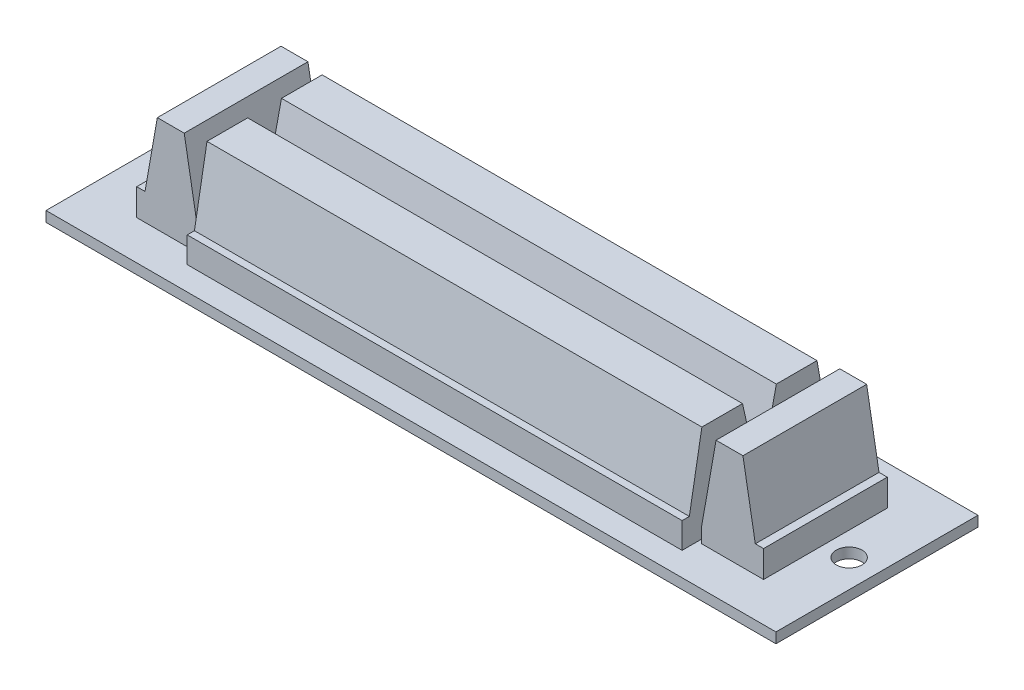
ISO-10303-21;
HEADER;
FILE_DESCRIPTION(('STEP AP214'),'2;1');
FILE_NAME('part.step','',(''),(''),'','','');
FILE_SCHEMA(('AUTOMOTIVE_DESIGN { 1 0 10303 214 1 1 1 1 }'));
ENDSEC;
DATA;
#1=APPLICATION_CONTEXT('core data for automotive mechanical design processes');
#2=APPLICATION_PROTOCOL_DEFINITION('international standard','automotive_design',2000,#1);
#3=PRODUCT_CONTEXT('',#1,'mechanical');
#4=PRODUCT('Part','Part','',(#3));
#5=PRODUCT_RELATED_PRODUCT_CATEGORY('part','',(#4));
#6=PRODUCT_DEFINITION_FORMATION('','',#4);
#7=PRODUCT_DEFINITION_CONTEXT('part definition',#1,'design');
#8=PRODUCT_DEFINITION('design','',#6,#7);
#9=PRODUCT_DEFINITION_SHAPE('','',#8);
#10=(LENGTH_UNIT() NAMED_UNIT(*) SI_UNIT(.MILLI.,.METRE.));
#11=(NAMED_UNIT(*) PLANE_ANGLE_UNIT() SI_UNIT($,.RADIAN.));
#12=(NAMED_UNIT(*) SI_UNIT($,.STERADIAN.) SOLID_ANGLE_UNIT());
#13=UNCERTAINTY_MEASURE_WITH_UNIT(LENGTH_MEASURE(1.E-05),#10,'distance_accuracy_value','');
#14=(GEOMETRIC_REPRESENTATION_CONTEXT(3) GLOBAL_UNCERTAINTY_ASSIGNED_CONTEXT((#13)) GLOBAL_UNIT_ASSIGNED_CONTEXT((#10,
#11,#12)) REPRESENTATION_CONTEXT('',''));
#15=CARTESIAN_POINT('',(0.,0.,0.));
#16=DIRECTION('',(0.,0.,1.));
#17=DIRECTION('',(1.,0.,0.));
#18=AXIS2_PLACEMENT_3D('',#15,#16,#17);
#19=CARTESIAN_POINT('',(0.,0.635,0.));
#20=DIRECTION('',(0.,1.,0.));
#21=DIRECTION('',(0.,0.,1.));
#22=AXIS2_PLACEMENT_3D('',#19,#20,#21);
#23=PLANE('',#22);
#24=DIRECTION('',(-1.,0.,0.));
#25=VECTOR('',#24,1.);
#26=CARTESIAN_POINT('',(38.608,0.635,7.62));
#27=LINE('',#26,#25);
#28=CARTESIAN_POINT('',(38.608,0.635,7.62));
#29=VERTEX_POINT('',#28);
#30=CARTESIAN_POINT('',(30.988,0.635,7.62));
#31=VERTEX_POINT('',#30);
#32=EDGE_CURVE('E242',#29,#31,#27,.T.);
#33=ORIENTED_EDGE('',*,*,#32,.T.);
#34=DIRECTION('',(0.,0.,-1.));
#35=VECTOR('',#34,1.);
#36=CARTESIAN_POINT('',(30.988,0.635,7.62));
#37=LINE('',#36,#35);
#38=CARTESIAN_POINT('',(30.988,0.635,-7.62));
#39=VERTEX_POINT('',#38);
#40=EDGE_CURVE('E967',#31,#39,#37,.T.);
#41=ORIENTED_EDGE('',*,*,#40,.T.);
#42=DIRECTION('',(-1.,0.,0.));
#43=VECTOR('',#42,1.);
#44=CARTESIAN_POINT('',(38.608,0.635,-7.62));
#45=LINE('',#44,#43);
#46=CARTESIAN_POINT('',(38.608,0.635,-7.62));
#47=VERTEX_POINT('',#46);
#48=EDGE_CURVE('E264',#47,#39,#45,.T.);
#49=ORIENTED_EDGE('',*,*,#48,.F.);
#50=DIRECTION('',(0.,0.,-1.));
#51=VECTOR('',#50,1.);
#52=CARTESIAN_POINT('',(38.608,0.635,7.62));
#53=LINE('',#52,#51);
#54=EDGE_CURVE('E258',#29,#47,#53,.T.);
#55=ORIENTED_EDGE('',*,*,#54,.F.);
#56=EDGE_LOOP('',(#33,#41,#49,#55));
#57=FACE_BOUND('',#56,.T.);
#58=DIRECTION('',(1.,0.,0.));
#59=VECTOR('',#58,1.);
#60=CARTESIAN_POINT('',(-38.608,0.635,7.62));
#61=LINE('',#60,#59);
#62=CARTESIAN_POINT('',(-38.608,0.635,7.62));
#63=VERTEX_POINT('',#62);
#64=CARTESIAN_POINT('',(-30.988,0.635,7.62));
#65=VERTEX_POINT('',#64);
#66=EDGE_CURVE('E274',#63,#65,#61,.T.);
#67=ORIENTED_EDGE('',*,*,#66,.F.);
#68=DIRECTION('',(0.,0.,-1.));
#69=VECTOR('',#68,1.);
#70=CARTESIAN_POINT('',(-38.608,0.635,7.62));
#71=LINE('',#70,#69);
#72=CARTESIAN_POINT('',(-38.608,0.635,-7.62));
#73=VERTEX_POINT('',#72);
#74=EDGE_CURVE('E289',#63,#73,#71,.T.);
#75=ORIENTED_EDGE('',*,*,#74,.T.);
#76=DIRECTION('',(1.,0.,0.));
#77=VECTOR('',#76,1.);
#78=CARTESIAN_POINT('',(-38.608,0.635,-7.62));
#79=LINE('',#78,#77);
#80=CARTESIAN_POINT('',(-30.988,0.635,-7.62));
#81=VERTEX_POINT('',#80);
#82=EDGE_CURVE('E265',#73,#81,#79,.T.);
#83=ORIENTED_EDGE('',*,*,#82,.T.);
#84=DIRECTION('',(0.,0.,-1.));
#85=VECTOR('',#84,1.);
#86=CARTESIAN_POINT('',(-30.988,0.635,7.62));
#87=LINE('',#86,#85);
#88=EDGE_CURVE('E72',#65,#81,#87,.T.);
#89=ORIENTED_EDGE('',*,*,#88,.F.);
#90=EDGE_LOOP('',(#67,#75,#83,#89));
#91=FACE_BOUND('',#90,.T.);
#92=CARTESIAN_POINT('',(-41.529,0.635,0.));
#93=DIRECTION('',(0.,1.,0.));
#94=DIRECTION('',(0.,0.,1.));
#95=AXIS2_PLACEMENT_3D('',#92,#93,#94);
#96=CIRCLE('',#95,1.5875);
#97=CARTESIAN_POINT('',(-41.529,0.635,1.5875));
#98=VERTEX_POINT('',#97);
#99=EDGE_CURVE('E405',#98,#98,#96,.T.);
#100=ORIENTED_EDGE('',*,*,#99,.F.);
#101=EDGE_LOOP('',(#100));
#102=FACE_BOUND('',#101,.T.);
#103=DIRECTION('',(0.,0.,-1.));
#104=VECTOR('',#103,1.);
#105=CARTESIAN_POINT('',(44.958,0.635,-12.446));
#106=LINE('',#105,#104);
#107=CARTESIAN_POINT('',(44.958,0.635,12.446));
#108=VERTEX_POINT('',#107);
#109=CARTESIAN_POINT('',(44.958,0.635,-12.446));
#110=VERTEX_POINT('',#109);
#111=EDGE_CURVE('E411',#108,#110,#106,.T.);
#112=ORIENTED_EDGE('',*,*,#111,.T.);
#113=DIRECTION('',(-1.,0.,0.));
#114=VECTOR('',#113,1.);
#115=CARTESIAN_POINT('',(-44.958,0.635,-12.446));
#116=LINE('',#115,#114);
#117=CARTESIAN_POINT('',(-44.958,0.635,-12.446));
#118=VERTEX_POINT('',#117);
#119=EDGE_CURVE('E414',#110,#118,#116,.T.);
#120=ORIENTED_EDGE('',*,*,#119,.T.);
#121=DIRECTION('',(0.,0.,1.));
#122=VECTOR('',#121,1.);
#123=CARTESIAN_POINT('',(-44.958,0.635,-12.446));
#124=LINE('',#123,#122);
#125=CARTESIAN_POINT('',(-44.958,0.635,12.446));
#126=VERTEX_POINT('',#125);
#127=EDGE_CURVE('E417',#118,#126,#124,.T.);
#128=ORIENTED_EDGE('',*,*,#127,.T.);
#129=DIRECTION('',(1.,0.,0.));
#130=VECTOR('',#129,1.);
#131=CARTESIAN_POINT('',(-44.958,0.635,12.446));
#132=LINE('',#131,#130);
#133=EDGE_CURVE('E419',#126,#108,#132,.T.);
#134=ORIENTED_EDGE('',*,*,#133,.T.);
#135=EDGE_LOOP('',(#112,#120,#128,#134));
#136=FACE_BOUND('',#135,.T.);
#137=CARTESIAN_POINT('',(41.529,0.635,0.));
#138=DIRECTION('',(0.,1.,0.));
#139=DIRECTION('',(0.,0.,-1.));
#140=AXIS2_PLACEMENT_3D('',#137,#138,#139);
#141=CIRCLE('',#140,1.5875);
#142=CARTESIAN_POINT('',(41.529,0.635,-1.58750000000001));
#143=VERTEX_POINT('',#142);
#144=EDGE_CURVE('E399',#143,#143,#141,.T.);
#145=ORIENTED_EDGE('',*,*,#144,.F.);
#146=EDGE_LOOP('',(#145));
#147=FACE_BOUND('',#146,.T.);
#148=DIRECTION('',(-1.,0.,0.));
#149=VECTOR('',#148,1.);
#150=CARTESIAN_POINT('',(30.48,0.635000000000001,-9.525));
#151=LINE('',#150,#149);
#152=CARTESIAN_POINT('',(30.48,0.635,-9.525));
#153=VERTEX_POINT('',#152);
#154=CARTESIAN_POINT('',(-30.48,0.635,-9.525));
#155=VERTEX_POINT('',#154);
#156=EDGE_CURVE('E395',#153,#155,#151,.T.);
#157=ORIENTED_EDGE('',*,*,#156,.F.);
#158=DIRECTION('',(0.,0.,-1.));
#159=VECTOR('',#158,1.);
#160=CARTESIAN_POINT('',(30.48,0.635000000000001,-9.525));
#161=LINE('',#160,#159);
#162=CARTESIAN_POINT('',(30.48,0.635,9.525));
#163=VERTEX_POINT('',#162);
#164=EDGE_CURVE('E320',#163,#153,#161,.T.);
#165=ORIENTED_EDGE('',*,*,#164,.F.);
#166=DIRECTION('',(-1.,0.,0.));
#167=VECTOR('',#166,1.);
#168=CARTESIAN_POINT('',(30.48,0.634999999999999,9.525));
#169=LINE('',#168,#167);
#170=CARTESIAN_POINT('',(-30.48,0.634999999999999,9.525));
#171=VERTEX_POINT('',#170);
#172=EDGE_CURVE('E345',#163,#171,#169,.T.);
#173=ORIENTED_EDGE('',*,*,#172,.T.);
#174=DIRECTION('',(0.,0.,-1.));
#175=VECTOR('',#174,1.);
#176=CARTESIAN_POINT('',(-30.48,0.635000000000001,-9.525));
#177=LINE('',#176,#175);
#178=EDGE_CURVE('E319',#171,#155,#177,.T.);
#179=ORIENTED_EDGE('',*,*,#178,.T.);
#180=EDGE_LOOP('',(#157,#165,#173,#179));
#181=FACE_BOUND('',#180,.T.);
#182=ADVANCED_FACE('F49',(#57,#91,#102,#136,#147,#181),#23,.T.);
#183=CARTESIAN_POINT('',(0.,-0.635,0.));
#184=DIRECTION('',(0.,1.,0.));
#185=DIRECTION('',(0.,0.,1.));
#186=AXIS2_PLACEMENT_3D('',#183,#184,#185);
#187=PLANE('',#186);
#188=DIRECTION('',(0.,0.,-1.));
#189=VECTOR('',#188,1.);
#190=CARTESIAN_POINT('',(44.958,-0.635,-12.446));
#191=LINE('',#190,#189);
#192=CARTESIAN_POINT('',(44.958,-0.635,12.446));
#193=VERTEX_POINT('',#192);
#194=CARTESIAN_POINT('',(44.958,-0.635,-12.446));
#195=VERTEX_POINT('',#194);
#196=EDGE_CURVE('E408',#193,#195,#191,.T.);
#197=ORIENTED_EDGE('',*,*,#196,.F.);
#198=DIRECTION('',(1.,0.,0.));
#199=VECTOR('',#198,1.);
#200=CARTESIAN_POINT('',(-44.958,-0.635,12.446));
#201=LINE('',#200,#199);
#202=CARTESIAN_POINT('',(-44.958,-0.635,12.446));
#203=VERTEX_POINT('',#202);
#204=EDGE_CURVE('E415',#203,#193,#201,.T.);
#205=ORIENTED_EDGE('',*,*,#204,.F.);
#206=DIRECTION('',(0.,0.,1.));
#207=VECTOR('',#206,1.);
#208=CARTESIAN_POINT('',(-44.958,-0.635,-12.446));
#209=LINE('',#208,#207);
#210=CARTESIAN_POINT('',(-44.958,-0.635,-12.446));
#211=VERTEX_POINT('',#210);
#212=EDGE_CURVE('E426',#211,#203,#209,.T.);
#213=ORIENTED_EDGE('',*,*,#212,.F.);
#214=DIRECTION('',(-1.,0.,0.));
#215=VECTOR('',#214,1.);
#216=CARTESIAN_POINT('',(-44.958,-0.635,-12.446));
#217=LINE('',#216,#215);
#218=EDGE_CURVE('E424',#195,#211,#217,.T.);
#219=ORIENTED_EDGE('',*,*,#218,.F.);
#220=EDGE_LOOP('',(#197,#205,#213,#219));
#221=FACE_BOUND('',#220,.T.);
#222=CARTESIAN_POINT('',(-41.529,-0.635,0.));
#223=DIRECTION('',(0.,1.,0.));
#224=DIRECTION('',(0.,0.,1.));
#225=AXIS2_PLACEMENT_3D('',#222,#223,#224);
#226=CIRCLE('',#225,1.5875);
#227=CARTESIAN_POINT('',(-41.529,-0.635,1.5875));
#228=VERTEX_POINT('',#227);
#229=EDGE_CURVE('E402',#228,#228,#226,.T.);
#230=ORIENTED_EDGE('',*,*,#229,.T.);
#231=EDGE_LOOP('',(#230));
#232=FACE_BOUND('',#231,.T.);
#233=CARTESIAN_POINT('',(41.529,-0.635,0.));
#234=DIRECTION('',(0.,1.,0.));
#235=DIRECTION('',(0.,0.,-1.));
#236=AXIS2_PLACEMENT_3D('',#233,#234,#235);
#237=CIRCLE('',#236,1.5875);
#238=CARTESIAN_POINT('',(41.529,-0.635,-1.58750000000001));
#239=VERTEX_POINT('',#238);
#240=EDGE_CURVE('E398',#239,#239,#237,.T.);
#241=ORIENTED_EDGE('',*,*,#240,.T.);
#242=EDGE_LOOP('',(#241));
#243=FACE_BOUND('',#242,.T.);
#244=ADVANCED_FACE('F444',(#221,#232,#243),#187,.F.);
#245=CARTESIAN_POINT('',(44.958,0.635,-12.446));
#246=DIRECTION('',(-1.,0.,0.));
#247=DIRECTION('',(0.,0.,1.));
#248=AXIS2_PLACEMENT_3D('',#245,#246,#247);
#249=PLANE('',#248);
#250=ORIENTED_EDGE('',*,*,#196,.T.);
#251=DIRECTION('',(0.,-1.,0.));
#252=VECTOR('',#251,1.);
#253=CARTESIAN_POINT('',(44.958,0.635,-12.446));
#254=LINE('',#253,#252);
#255=EDGE_CURVE('E11',#110,#195,#254,.T.);
#256=ORIENTED_EDGE('',*,*,#255,.F.);
#257=ORIENTED_EDGE('',*,*,#111,.F.);
#258=DIRECTION('',(0.,-1.,0.));
#259=VECTOR('',#258,1.);
#260=CARTESIAN_POINT('',(44.958,0.635,12.446));
#261=LINE('',#260,#259);
#262=EDGE_CURVE('E421',#108,#193,#261,.T.);
#263=ORIENTED_EDGE('',*,*,#262,.T.);
#264=EDGE_LOOP('',(#250,#256,#257,#263));
#265=FACE_BOUND('',#264,.T.);
#266=ADVANCED_FACE('F51',(#265),#249,.F.);
#267=CARTESIAN_POINT('',(-44.958,0.635,-12.446));
#268=DIRECTION('',(0.,0.,1.));
#269=DIRECTION('',(1.,0.,0.));
#270=AXIS2_PLACEMENT_3D('',#267,#268,#269);
#271=PLANE('',#270);
#272=ORIENTED_EDGE('',*,*,#218,.T.);
#273=DIRECTION('',(0.,-1.,0.));
#274=VECTOR('',#273,1.);
#275=CARTESIAN_POINT('',(-44.958,0.635,-12.446));
#276=LINE('',#275,#274);
#277=EDGE_CURVE('E57',#118,#211,#276,.T.);
#278=ORIENTED_EDGE('',*,*,#277,.F.);
#279=ORIENTED_EDGE('',*,*,#119,.F.);
#280=ORIENTED_EDGE('',*,*,#255,.T.);
#281=EDGE_LOOP('',(#272,#278,#279,#280));
#282=FACE_BOUND('',#281,.T.);
#283=ADVANCED_FACE('F455',(#282),#271,.F.);
#284=CARTESIAN_POINT('',(-44.958,0.635,-12.446));
#285=DIRECTION('',(1.,0.,0.));
#286=DIRECTION('',(0.,0.,-1.));
#287=AXIS2_PLACEMENT_3D('',#284,#285,#286);
#288=PLANE('',#287);
#289=ORIENTED_EDGE('',*,*,#212,.T.);
#290=DIRECTION('',(0.,-1.,0.));
#291=VECTOR('',#290,1.);
#292=CARTESIAN_POINT('',(-44.958,0.635,12.446));
#293=LINE('',#292,#291);
#294=EDGE_CURVE('E431',#126,#203,#293,.T.);
#295=ORIENTED_EDGE('',*,*,#294,.F.);
#296=ORIENTED_EDGE('',*,*,#127,.F.);
#297=ORIENTED_EDGE('',*,*,#277,.T.);
#298=EDGE_LOOP('',(#289,#295,#296,#297));
#299=FACE_BOUND('',#298,.T.);
#300=ADVANCED_FACE('F438',(#299),#288,.F.);
#301=CARTESIAN_POINT('',(-44.958,0.635,12.446));
#302=DIRECTION('',(0.,0.,-1.));
#303=DIRECTION('',(-1.,0.,0.));
#304=AXIS2_PLACEMENT_3D('',#301,#302,#303);
#305=PLANE('',#304);
#306=ORIENTED_EDGE('',*,*,#204,.T.);
#307=ORIENTED_EDGE('',*,*,#262,.F.);
#308=ORIENTED_EDGE('',*,*,#133,.F.);
#309=ORIENTED_EDGE('',*,*,#294,.T.);
#310=EDGE_LOOP('',(#306,#307,#308,#309));
#311=FACE_BOUND('',#310,.T.);
#312=ADVANCED_FACE('F448',(#311),#305,.F.);
#313=CARTESIAN_POINT('',(-41.529,0.635,0.));
#314=DIRECTION('',(0.,-1.,0.));
#315=DIRECTION('',(0.,0.,-1.));
#316=AXIS2_PLACEMENT_3D('',#313,#314,#315);
#317=CYLINDRICAL_SURFACE('',#316,1.5875);
#318=ORIENTED_EDGE('',*,*,#99,.T.);
#319=EDGE_LOOP('',(#318));
#320=FACE_BOUND('',#319,.T.);
#321=ORIENTED_EDGE('',*,*,#229,.F.);
#322=EDGE_LOOP('',(#321));
#323=FACE_BOUND('',#322,.T.);
#324=ADVANCED_FACE('F469',(#320,#323),#317,.F.);
#325=CARTESIAN_POINT('',(41.529,0.635,0.));
#326=DIRECTION('',(0.,-1.,0.));
#327=DIRECTION('',(0.,0.,-1.));
#328=AXIS2_PLACEMENT_3D('',#325,#326,#327);
#329=CYLINDRICAL_SURFACE('',#328,1.5875);
#330=ORIENTED_EDGE('',*,*,#144,.T.);
#331=EDGE_LOOP('',(#330));
#332=FACE_BOUND('',#331,.T.);
#333=ORIENTED_EDGE('',*,*,#240,.F.);
#334=EDGE_LOOP('',(#333));
#335=FACE_BOUND('',#334,.T.);
#336=ADVANCED_FACE('F476',(#332,#335),#329,.F.);
#337=CARTESIAN_POINT('',(30.48,0.635000000000001,-9.525));
#338=DIRECTION('',(0.,0.,1.));
#339=DIRECTION('',(1.,0.,0.));
#340=AXIS2_PLACEMENT_3D('',#337,#338,#339);
#341=PLANE('',#340);
#342=DIRECTION('',(0.,1.,0.));
#343=VECTOR('',#342,1.);
#344=CARTESIAN_POINT('',(-30.48,0.635000000000001,-9.525));
#345=LINE('',#344,#343);
#346=CARTESIAN_POINT('',(-30.48,3.81,-9.525));
#347=VERTEX_POINT('',#346);
#348=EDGE_CURVE('E347',#155,#347,#345,.T.);
#349=ORIENTED_EDGE('',*,*,#348,.T.);
#350=DIRECTION('',(-1.,0.,0.));
#351=VECTOR('',#350,1.);
#352=CARTESIAN_POINT('',(30.48,3.81,-9.525));
#353=LINE('',#352,#351);
#354=CARTESIAN_POINT('',(30.48,3.81,-9.525));
#355=VERTEX_POINT('',#354);
#356=EDGE_CURVE('E392',#355,#347,#353,.T.);
#357=ORIENTED_EDGE('',*,*,#356,.F.);
#358=DIRECTION('',(0.,1.,0.));
#359=VECTOR('',#358,1.);
#360=CARTESIAN_POINT('',(30.48,0.635000000000001,-9.525));
#361=LINE('',#360,#359);
#362=EDGE_CURVE('E323',#153,#355,#361,.T.);
#363=ORIENTED_EDGE('',*,*,#362,.F.);
#364=ORIENTED_EDGE('',*,*,#156,.T.);
#365=EDGE_LOOP('',(#349,#357,#363,#364));
#366=FACE_BOUND('',#365,.T.);
#367=ADVANCED_FACE('F481',(#366),#341,.F.);
#368=CARTESIAN_POINT('',(30.48,3.81,-9.525));
#369=DIRECTION('',(0.,-1.,0.));
#370=DIRECTION('',(0.,0.,-1.));
#371=AXIS2_PLACEMENT_3D('',#368,#369,#370);
#372=PLANE('',#371);
#373=DIRECTION('',(0.,0.,1.));
#374=VECTOR('',#373,1.);
#375=CARTESIAN_POINT('',(-30.48,3.81,-9.525));
#376=LINE('',#375,#374);
#377=CARTESIAN_POINT('',(-30.48,3.81,-8.636));
#378=VERTEX_POINT('',#377);
#379=EDGE_CURVE('E349',#347,#378,#376,.T.);
#380=ORIENTED_EDGE('',*,*,#379,.T.);
#381=DIRECTION('',(-1.,0.,0.));
#382=VECTOR('',#381,1.);
#383=CARTESIAN_POINT('',(30.48,3.81,-8.636));
#384=LINE('',#383,#382);
#385=CARTESIAN_POINT('',(30.48,3.81,-8.636));
#386=VERTEX_POINT('',#385);
#387=EDGE_CURVE('E389',#386,#378,#384,.T.);
#388=ORIENTED_EDGE('',*,*,#387,.F.);
#389=DIRECTION('',(0.,0.,1.));
#390=VECTOR('',#389,1.);
#391=CARTESIAN_POINT('',(30.48,3.81,-9.525));
#392=LINE('',#391,#390);
#393=EDGE_CURVE('E326',#355,#386,#392,.T.);
#394=ORIENTED_EDGE('',*,*,#393,.F.);
#395=ORIENTED_EDGE('',*,*,#356,.T.);
#396=EDGE_LOOP('',(#380,#388,#394,#395));
#397=FACE_BOUND('',#396,.T.);
#398=ADVANCED_FACE('F493',(#397),#372,.F.);
#399=CARTESIAN_POINT('',(30.48,3.81,-8.636));
#400=DIRECTION('',(0.,-0.173648177666927,0.984807753012209));
#401=DIRECTION('',(0.,-0.984807753012209,-0.173648177666927));
#402=AXIS2_PLACEMENT_3D('',#399,#400,#401);
#403=PLANE('',#402);
#404=DIRECTION('',(0.,0.984807753012209,0.173648177666927));
#405=VECTOR('',#404,1.);
#406=CARTESIAN_POINT('',(-30.48,3.81,-8.636));
#407=LINE('',#406,#405);
#408=CARTESIAN_POINT('',(-30.48,12.573,-7.09084666805176));
#409=VERTEX_POINT('',#408);
#410=EDGE_CURVE('E351',#378,#409,#407,.T.);
#411=ORIENTED_EDGE('',*,*,#410,.T.);
#412=DIRECTION('',(-1.,0.,0.));
#413=VECTOR('',#412,1.);
#414=CARTESIAN_POINT('',(30.48,12.573,-7.09084666805176));
#415=LINE('',#414,#413);
#416=CARTESIAN_POINT('',(30.48,12.573,-7.09084666805176));
#417=VERTEX_POINT('',#416);
#418=EDGE_CURVE('E386',#417,#409,#415,.T.);
#419=ORIENTED_EDGE('',*,*,#418,.F.);
#420=DIRECTION('',(0.,0.984807753012209,0.173648177666927));
#421=VECTOR('',#420,1.);
#422=CARTESIAN_POINT('',(30.48,3.81,-8.636));
#423=LINE('',#422,#421);
#424=EDGE_CURVE('E328',#386,#417,#423,.T.);
#425=ORIENTED_EDGE('',*,*,#424,.F.);
#426=ORIENTED_EDGE('',*,*,#387,.T.);
#427=EDGE_LOOP('',(#411,#419,#425,#426));
#428=FACE_BOUND('',#427,.T.);
#429=ADVANCED_FACE('F499',(#428),#403,.F.);
#430=CARTESIAN_POINT('',(30.48,12.573,-7.09084666805176));
#431=DIRECTION('',(0.,-1.,0.));
#432=DIRECTION('',(0.,0.,-1.));
#433=AXIS2_PLACEMENT_3D('',#430,#431,#432);
#434=PLANE('',#433);
#435=DIRECTION('',(0.,0.,1.));
#436=VECTOR('',#435,1.);
#437=CARTESIAN_POINT('',(-30.48,12.573,-7.09084666805176));
#438=LINE('',#437,#436);
#439=CARTESIAN_POINT('',(-30.48,12.573,-2.08348643951836));
#440=VERTEX_POINT('',#439);
#441=EDGE_CURVE('E353',#409,#440,#438,.T.);
#442=ORIENTED_EDGE('',*,*,#441,.T.);
#443=DIRECTION('',(-1.,0.,0.));
#444=VECTOR('',#443,1.);
#445=CARTESIAN_POINT('',(30.48,12.573,-2.08348643951836));
#446=LINE('',#445,#444);
#447=CARTESIAN_POINT('',(30.48,12.573,-2.08348643951836));
#448=VERTEX_POINT('',#447);
#449=EDGE_CURVE('E383',#448,#440,#446,.T.);
#450=ORIENTED_EDGE('',*,*,#449,.F.);
#451=DIRECTION('',(0.,0.,1.));
#452=VECTOR('',#451,1.);
#453=CARTESIAN_POINT('',(30.48,12.573,-7.09084666805176));
#454=LINE('',#453,#452);
#455=EDGE_CURVE('E330',#417,#448,#454,.T.);
#456=ORIENTED_EDGE('',*,*,#455,.F.);
#457=ORIENTED_EDGE('',*,*,#418,.T.);
#458=EDGE_LOOP('',(#442,#450,#456,#457));
#459=FACE_BOUND('',#458,.T.);
#460=ADVANCED_FACE('F503',(#459),#434,.F.);
#461=CARTESIAN_POINT('',(30.48,12.573,-2.08348643951836));
#462=DIRECTION('',(0.,-0.216439613938104,-0.976296007119933));
#463=DIRECTION('',(0.,0.976296007119933,-0.216439613938104));
#464=AXIS2_PLACEMENT_3D('',#461,#462,#463);
#465=PLANE('',#464);
#466=DIRECTION('',(0.,-0.976296007119933,0.216439613938104));
#467=VECTOR('',#466,1.);
#468=CARTESIAN_POINT('',(-30.48,12.573,-2.08348643951836));
#469=LINE('',#468,#467);
#470=CARTESIAN_POINT('',(-30.48,3.175,0.));
#471=VERTEX_POINT('',#470);
#472=EDGE_CURVE('E355',#440,#471,#469,.T.);
#473=ORIENTED_EDGE('',*,*,#472,.T.);
#474=DIRECTION('',(-1.,0.,0.));
#475=VECTOR('',#474,1.);
#476=CARTESIAN_POINT('',(30.48,3.175,0.));
#477=LINE('',#476,#475);
#478=CARTESIAN_POINT('',(30.48,3.175,0.));
#479=VERTEX_POINT('',#478);
#480=EDGE_CURVE('E380',#479,#471,#477,.T.);
#481=ORIENTED_EDGE('',*,*,#480,.F.);
#482=DIRECTION('',(0.,-0.976296007119933,0.216439613938104));
#483=VECTOR('',#482,1.);
#484=CARTESIAN_POINT('',(30.48,12.573,-2.08348643951836));
#485=LINE('',#484,#483);
#486=EDGE_CURVE('E332',#448,#479,#485,.T.);
#487=ORIENTED_EDGE('',*,*,#486,.F.);
#488=ORIENTED_EDGE('',*,*,#449,.T.);
#489=EDGE_LOOP('',(#473,#481,#487,#488));
#490=FACE_BOUND('',#489,.T.);
#491=ADVANCED_FACE('F507',(#490),#465,.F.);
#492=CARTESIAN_POINT('',(30.48,12.573,2.08348643951836));
#493=DIRECTION('',(0.,-0.216439613938104,0.976296007119933));
#494=DIRECTION('',(0.,-0.976296007119933,-0.216439613938104));
#495=AXIS2_PLACEMENT_3D('',#492,#493,#494);
#496=PLANE('',#495);
#497=DIRECTION('',(0.,0.976296007119933,0.216439613938104));
#498=VECTOR('',#497,1.);
#499=CARTESIAN_POINT('',(-30.48,12.573,2.08348643951836));
#500=LINE('',#499,#498);
#501=CARTESIAN_POINT('',(-30.48,12.573,2.08348643951836));
#502=VERTEX_POINT('',#501);
#503=EDGE_CURVE('E357',#471,#502,#500,.T.);
#504=ORIENTED_EDGE('',*,*,#503,.T.);
#505=DIRECTION('',(-1.,0.,0.));
#506=VECTOR('',#505,1.);
#507=CARTESIAN_POINT('',(30.48,12.573,2.08348643951836));
#508=LINE('',#507,#506);
#509=CARTESIAN_POINT('',(30.48,12.573,2.08348643951836));
#510=VERTEX_POINT('',#509);
#511=EDGE_CURVE('E377',#510,#502,#508,.T.);
#512=ORIENTED_EDGE('',*,*,#511,.F.);
#513=DIRECTION('',(0.,0.976296007119933,0.216439613938104));
#514=VECTOR('',#513,1.);
#515=CARTESIAN_POINT('',(30.48,12.573,2.08348643951836));
#516=LINE('',#515,#514);
#517=EDGE_CURVE('E334',#479,#510,#516,.T.);
#518=ORIENTED_EDGE('',*,*,#517,.F.);
#519=ORIENTED_EDGE('',*,*,#480,.T.);
#520=EDGE_LOOP('',(#504,#512,#518,#519));
#521=FACE_BOUND('',#520,.T.);
#522=ADVANCED_FACE('F511',(#521),#496,.F.);
#523=CARTESIAN_POINT('',(30.48,12.573,7.09084666805176));
#524=DIRECTION('',(0.,-1.,0.));
#525=DIRECTION('',(0.,0.,-1.));
#526=AXIS2_PLACEMENT_3D('',#523,#524,#525);
#527=PLANE('',#526);
#528=DIRECTION('',(0.,0.,1.));
#529=VECTOR('',#528,1.);
#530=CARTESIAN_POINT('',(-30.48,12.573,7.09084666805176));
#531=LINE('',#530,#529);
#532=CARTESIAN_POINT('',(-30.48,12.573,7.09084666805176));
#533=VERTEX_POINT('',#532);
#534=EDGE_CURVE('E359',#502,#533,#531,.T.);
#535=ORIENTED_EDGE('',*,*,#534,.T.);
#536=DIRECTION('',(-1.,0.,0.));
#537=VECTOR('',#536,1.);
#538=CARTESIAN_POINT('',(30.48,12.573,7.09084666805176));
#539=LINE('',#538,#537);
#540=CARTESIAN_POINT('',(30.48,12.573,7.09084666805176));
#541=VERTEX_POINT('',#540);
#542=EDGE_CURVE('E374',#541,#533,#539,.T.);
#543=ORIENTED_EDGE('',*,*,#542,.F.);
#544=DIRECTION('',(0.,0.,1.));
#545=VECTOR('',#544,1.);
#546=CARTESIAN_POINT('',(30.48,12.573,7.09084666805176));
#547=LINE('',#546,#545);
#548=EDGE_CURVE('E336',#510,#541,#547,.T.);
#549=ORIENTED_EDGE('',*,*,#548,.F.);
#550=ORIENTED_EDGE('',*,*,#511,.T.);
#551=EDGE_LOOP('',(#535,#543,#549,#550));
#552=FACE_BOUND('',#551,.T.);
#553=ADVANCED_FACE('F515',(#552),#527,.F.);
#554=CARTESIAN_POINT('',(30.48,3.81,8.636));
#555=DIRECTION('',(0.,-0.173648177666926,-0.984807753012209));
#556=DIRECTION('',(0.,0.984807753012209,-0.173648177666926));
#557=AXIS2_PLACEMENT_3D('',#554,#555,#556);
#558=PLANE('',#557);
#559=DIRECTION('',(0.,-0.984807753012209,0.173648177666926));
#560=VECTOR('',#559,1.);
#561=CARTESIAN_POINT('',(-30.48,3.81,8.636));
#562=LINE('',#561,#560);
#563=CARTESIAN_POINT('',(-30.48,3.81,8.636));
#564=VERTEX_POINT('',#563);
#565=EDGE_CURVE('E361',#533,#564,#562,.T.);
#566=ORIENTED_EDGE('',*,*,#565,.T.);
#567=DIRECTION('',(-1.,0.,0.));
#568=VECTOR('',#567,1.);
#569=CARTESIAN_POINT('',(30.48,3.81,8.636));
#570=LINE('',#569,#568);
#571=CARTESIAN_POINT('',(30.48,3.81,8.636));
#572=VERTEX_POINT('',#571);
#573=EDGE_CURVE('E371',#572,#564,#570,.T.);
#574=ORIENTED_EDGE('',*,*,#573,.F.);
#575=DIRECTION('',(0.,-0.984807753012209,0.173648177666926));
#576=VECTOR('',#575,1.);
#577=CARTESIAN_POINT('',(30.48,3.81,8.636));
#578=LINE('',#577,#576);
#579=EDGE_CURVE('E338',#541,#572,#578,.T.);
#580=ORIENTED_EDGE('',*,*,#579,.F.);
#581=ORIENTED_EDGE('',*,*,#542,.T.);
#582=EDGE_LOOP('',(#566,#574,#580,#581));
#583=FACE_BOUND('',#582,.T.);
#584=ADVANCED_FACE('F519',(#583),#558,.F.);
#585=CARTESIAN_POINT('',(30.48,3.81,9.525));
#586=DIRECTION('',(0.,-1.,0.));
#587=DIRECTION('',(0.,0.,-1.));
#588=AXIS2_PLACEMENT_3D('',#585,#586,#587);
#589=PLANE('',#588);
#590=DIRECTION('',(0.,0.,1.));
#591=VECTOR('',#590,1.);
#592=CARTESIAN_POINT('',(-30.48,3.81,9.525));
#593=LINE('',#592,#591);
#594=CARTESIAN_POINT('',(-30.48,3.81,9.525));
#595=VERTEX_POINT('',#594);
#596=EDGE_CURVE('E363',#564,#595,#593,.T.);
#597=ORIENTED_EDGE('',*,*,#596,.T.);
#598=DIRECTION('',(-1.,0.,0.));
#599=VECTOR('',#598,1.);
#600=CARTESIAN_POINT('',(30.48,3.81,9.525));
#601=LINE('',#600,#599);
#602=CARTESIAN_POINT('',(30.48,3.81,9.525));
#603=VERTEX_POINT('',#602);
#604=EDGE_CURVE('E368',#603,#595,#601,.T.);
#605=ORIENTED_EDGE('',*,*,#604,.F.);
#606=DIRECTION('',(0.,0.,1.));
#607=VECTOR('',#606,1.);
#608=CARTESIAN_POINT('',(30.48,3.81,9.525));
#609=LINE('',#608,#607);
#610=EDGE_CURVE('E340',#572,#603,#609,.T.);
#611=ORIENTED_EDGE('',*,*,#610,.F.);
#612=ORIENTED_EDGE('',*,*,#573,.T.);
#613=EDGE_LOOP('',(#597,#605,#611,#612));
#614=FACE_BOUND('',#613,.T.);
#615=ADVANCED_FACE('F523',(#614),#589,.F.);
#616=CARTESIAN_POINT('',(30.48,0.634999999999999,9.525));
#617=DIRECTION('',(0.,0.,-1.));
#618=DIRECTION('',(-1.,0.,0.));
#619=AXIS2_PLACEMENT_3D('',#616,#617,#618);
#620=PLANE('',#619);
#621=DIRECTION('',(0.,-1.,0.));
#622=VECTOR('',#621,1.);
#623=CARTESIAN_POINT('',(-30.48,0.634999999999999,9.525));
#624=LINE('',#623,#622);
#625=EDGE_CURVE('E324',#595,#171,#624,.T.);
#626=ORIENTED_EDGE('',*,*,#625,.T.);
#627=ORIENTED_EDGE('',*,*,#172,.F.);
#628=DIRECTION('',(0.,-1.,0.));
#629=VECTOR('',#628,1.);
#630=CARTESIAN_POINT('',(30.48,0.634999999999999,9.525));
#631=LINE('',#630,#629);
#632=EDGE_CURVE('E342',#603,#163,#631,.T.);
#633=ORIENTED_EDGE('',*,*,#632,.F.);
#634=ORIENTED_EDGE('',*,*,#604,.T.);
#635=EDGE_LOOP('',(#626,#627,#633,#634));
#636=FACE_BOUND('',#635,.T.);
#637=ADVANCED_FACE('F527',(#636),#620,.F.);
#638=CARTESIAN_POINT('',(30.48,0.,0.));
#639=DIRECTION('',(-1.,0.,0.));
#640=DIRECTION('',(0.,0.,1.));
#641=AXIS2_PLACEMENT_3D('',#638,#639,#640);
#642=PLANE('',#641);
#643=ORIENTED_EDGE('',*,*,#164,.T.);
#644=ORIENTED_EDGE('',*,*,#362,.T.);
#645=ORIENTED_EDGE('',*,*,#393,.T.);
#646=ORIENTED_EDGE('',*,*,#424,.T.);
#647=ORIENTED_EDGE('',*,*,#455,.T.);
#648=ORIENTED_EDGE('',*,*,#486,.T.);
#649=ORIENTED_EDGE('',*,*,#517,.T.);
#650=ORIENTED_EDGE('',*,*,#548,.T.);
#651=ORIENTED_EDGE('',*,*,#579,.T.);
#652=ORIENTED_EDGE('',*,*,#610,.T.);
#653=ORIENTED_EDGE('',*,*,#632,.T.);
#654=EDGE_LOOP('',(#643,#644,#645,#646,#647,#648,#649,#650,#651,#652,#653));
#655=FACE_BOUND('',#654,.T.);
#656=ADVANCED_FACE('F531',(#655),#642,.F.);
#657=CARTESIAN_POINT('',(-30.48,0.,0.));
#658=DIRECTION('',(-1.,0.,0.));
#659=DIRECTION('',(0.,0.,1.));
#660=AXIS2_PLACEMENT_3D('',#657,#658,#659);
#661=PLANE('',#660);
#662=ORIENTED_EDGE('',*,*,#178,.F.);
#663=ORIENTED_EDGE('',*,*,#625,.F.);
#664=ORIENTED_EDGE('',*,*,#596,.F.);
#665=ORIENTED_EDGE('',*,*,#565,.F.);
#666=ORIENTED_EDGE('',*,*,#534,.F.);
#667=ORIENTED_EDGE('',*,*,#503,.F.);
#668=ORIENTED_EDGE('',*,*,#472,.F.);
#669=ORIENTED_EDGE('',*,*,#441,.F.);
#670=ORIENTED_EDGE('',*,*,#410,.F.);
#671=ORIENTED_EDGE('',*,*,#379,.F.);
#672=ORIENTED_EDGE('',*,*,#348,.F.);
#673=EDGE_LOOP('',(#662,#663,#664,#665,#666,#667,#668,#669,#670,#671,#672));
#674=FACE_BOUND('',#673,.T.);
#675=ADVANCED_FACE('F533',(#674),#661,.T.);
#676=CARTESIAN_POINT('',(-30.988,0.635,7.62));
#677=DIRECTION('',(-1.,0.,0.));
#678=DIRECTION('',(0.,0.,1.));
#679=AXIS2_PLACEMENT_3D('',#676,#677,#678);
#680=PLANE('',#679);
#681=DIRECTION('',(0.,1.,0.));
#682=VECTOR('',#681,1.);
#683=CARTESIAN_POINT('',(-30.988,0.635,-7.62));
#684=LINE('',#683,#682);
#685=CARTESIAN_POINT('',(-30.988,2.54,-7.62));
#686=VERTEX_POINT('',#685);
#687=EDGE_CURVE('E268',#81,#686,#684,.T.);
#688=ORIENTED_EDGE('',*,*,#687,.T.);
#689=DIRECTION('',(0.,0.,-1.));
#690=VECTOR('',#689,1.);
#691=CARTESIAN_POINT('',(-30.988,2.54,7.62));
#692=LINE('',#691,#690);
#693=CARTESIAN_POINT('',(-30.988,2.54,7.62));
#694=VERTEX_POINT('',#693);
#695=EDGE_CURVE('E315',#694,#686,#692,.T.);
#696=ORIENTED_EDGE('',*,*,#695,.F.);
#697=DIRECTION('',(0.,1.,0.));
#698=VECTOR('',#697,1.);
#699=CARTESIAN_POINT('',(-30.988,0.635,7.62));
#700=LINE('',#699,#698);
#701=EDGE_CURVE('E277',#65,#694,#700,.T.);
#702=ORIENTED_EDGE('',*,*,#701,.F.);
#703=ORIENTED_EDGE('',*,*,#88,.T.);
#704=EDGE_LOOP('',(#688,#696,#702,#703));
#705=FACE_BOUND('',#704,.T.);
#706=ADVANCED_FACE('F536',(#705),#680,.F.);
#707=CARTESIAN_POINT('',(-30.988,2.54,7.62));
#708=DIRECTION('',(-0.984807753012208,-0.173648177666931,0.));
#709=DIRECTION('',(0.173648177666931,-0.984807753012208,0.));
#710=AXIS2_PLACEMENT_3D('',#707,#708,#709);
#711=PLANE('',#710);
#712=DIRECTION('',(-0.173648177666931,0.984807753012208,0.));
#713=VECTOR('',#712,1.);
#714=CARTESIAN_POINT('',(-30.988,2.54,-7.62));
#715=LINE('',#714,#713);
#716=CARTESIAN_POINT('',(-32.757088597448,12.573,-7.62));
#717=VERTEX_POINT('',#716);
#718=EDGE_CURVE('E292',#686,#717,#715,.T.);
#719=ORIENTED_EDGE('',*,*,#718,.T.);
#720=DIRECTION('',(0.,0.,-1.));
#721=VECTOR('',#720,1.);
#722=CARTESIAN_POINT('',(-32.757088597448,12.573,7.62));
#723=LINE('',#722,#721);
#724=CARTESIAN_POINT('',(-32.757088597448,12.573,7.62));
#725=VERTEX_POINT('',#724);
#726=EDGE_CURVE('E312',#725,#717,#723,.T.);
#727=ORIENTED_EDGE('',*,*,#726,.F.);
#728=DIRECTION('',(-0.173648177666931,0.984807753012208,0.));
#729=VECTOR('',#728,1.);
#730=CARTESIAN_POINT('',(-30.988,2.54,7.62));
#731=LINE('',#730,#729);
#732=EDGE_CURVE('E280',#694,#725,#731,.T.);
#733=ORIENTED_EDGE('',*,*,#732,.F.);
#734=ORIENTED_EDGE('',*,*,#695,.T.);
#735=EDGE_LOOP('',(#719,#727,#733,#734));
#736=FACE_BOUND('',#735,.T.);
#737=ADVANCED_FACE('F543',(#736),#711,.F.);
#738=CARTESIAN_POINT('',(-32.757088597448,12.573,7.62));
#739=DIRECTION('',(0.,-1.,0.));
#740=DIRECTION('',(1.,0.,0.));
#741=AXIS2_PLACEMENT_3D('',#738,#739,#740);
#742=PLANE('',#741);
#743=DIRECTION('',(-1.,0.,0.));
#744=VECTOR('',#743,1.);
#745=CARTESIAN_POINT('',(-32.757088597448,12.573,-7.62));
#746=LINE('',#745,#744);
#747=CARTESIAN_POINT('',(-36.0692401946017,12.573,-7.62));
#748=VERTEX_POINT('',#747);
#749=EDGE_CURVE('E294',#717,#748,#746,.T.);
#750=ORIENTED_EDGE('',*,*,#749,.T.);
#751=DIRECTION('',(0.,0.,-1.));
#752=VECTOR('',#751,1.);
#753=CARTESIAN_POINT('',(-36.0692401946017,12.573,7.62));
#754=LINE('',#753,#752);
#755=CARTESIAN_POINT('',(-36.0692401946017,12.573,7.62));
#756=VERTEX_POINT('',#755);
#757=EDGE_CURVE('E309',#756,#748,#754,.T.);
#758=ORIENTED_EDGE('',*,*,#757,.F.);
#759=DIRECTION('',(-1.,0.,0.));
#760=VECTOR('',#759,1.);
#761=CARTESIAN_POINT('',(-32.757088597448,12.573,7.62));
#762=LINE('',#761,#760);
#763=EDGE_CURVE('E282',#725,#756,#762,.T.);
#764=ORIENTED_EDGE('',*,*,#763,.F.);
#765=ORIENTED_EDGE('',*,*,#726,.T.);
#766=EDGE_LOOP('',(#750,#758,#764,#765));
#767=FACE_BOUND('',#766,.T.);
#768=ADVANCED_FACE('F546',(#767),#742,.F.);
#769=CARTESIAN_POINT('',(-36.0692401946017,12.573,7.62));
#770=DIRECTION('',(0.984807753012209,-0.173648177666927,0.));
#771=DIRECTION('',(0.173648177666927,0.984807753012209,0.));
#772=AXIS2_PLACEMENT_3D('',#769,#770,#771);
#773=PLANE('',#772);
#774=DIRECTION('',(-0.173648177666927,-0.984807753012209,0.));
#775=VECTOR('',#774,1.);
#776=CARTESIAN_POINT('',(-36.0692401946017,12.573,-7.62));
#777=LINE('',#776,#775);
#778=CARTESIAN_POINT('',(-37.592,3.937,-7.62));
#779=VERTEX_POINT('',#778);
#780=EDGE_CURVE('E296',#748,#779,#777,.T.);
#781=ORIENTED_EDGE('',*,*,#780,.T.);
#782=DIRECTION('',(0.,0.,-1.));
#783=VECTOR('',#782,1.);
#784=CARTESIAN_POINT('',(-37.592,3.937,7.62));
#785=LINE('',#784,#783);
#786=CARTESIAN_POINT('',(-37.592,3.937,7.62));
#787=VERTEX_POINT('',#786);
#788=EDGE_CURVE('E306',#787,#779,#785,.T.);
#789=ORIENTED_EDGE('',*,*,#788,.F.);
#790=DIRECTION('',(-0.173648177666927,-0.984807753012209,0.));
#791=VECTOR('',#790,1.);
#792=CARTESIAN_POINT('',(-36.0692401946017,12.573,7.62));
#793=LINE('',#792,#791);
#794=EDGE_CURVE('E284',#756,#787,#793,.T.);
#795=ORIENTED_EDGE('',*,*,#794,.F.);
#796=ORIENTED_EDGE('',*,*,#757,.T.);
#797=EDGE_LOOP('',(#781,#789,#795,#796));
#798=FACE_BOUND('',#797,.T.);
#799=ADVANCED_FACE('F550',(#798),#773,.F.);
#800=CARTESIAN_POINT('',(-37.592,3.937,7.62));
#801=DIRECTION('',(0.,-1.,0.));
#802=DIRECTION('',(0.,0.,-1.));
#803=AXIS2_PLACEMENT_3D('',#800,#801,#802);
#804=PLANE('',#803);
#805=DIRECTION('',(-1.,0.,0.));
#806=VECTOR('',#805,1.);
#807=CARTESIAN_POINT('',(-37.592,3.937,-7.62));
#808=LINE('',#807,#806);
#809=CARTESIAN_POINT('',(-38.608,3.937,-7.62));
#810=VERTEX_POINT('',#809);
#811=EDGE_CURVE('E298',#779,#810,#808,.T.);
#812=ORIENTED_EDGE('',*,*,#811,.T.);
#813=DIRECTION('',(0.,0.,-1.));
#814=VECTOR('',#813,1.);
#815=CARTESIAN_POINT('',(-38.608,3.937,7.62));
#816=LINE('',#815,#814);
#817=CARTESIAN_POINT('',(-38.608,3.937,7.62));
#818=VERTEX_POINT('',#817);
#819=EDGE_CURVE('E303',#818,#810,#816,.T.);
#820=ORIENTED_EDGE('',*,*,#819,.F.);
#821=DIRECTION('',(-1.,0.,0.));
#822=VECTOR('',#821,1.);
#823=CARTESIAN_POINT('',(-37.592,3.937,7.62));
#824=LINE('',#823,#822);
#825=EDGE_CURVE('E286',#787,#818,#824,.T.);
#826=ORIENTED_EDGE('',*,*,#825,.F.);
#827=ORIENTED_EDGE('',*,*,#788,.T.);
#828=EDGE_LOOP('',(#812,#820,#826,#827));
#829=FACE_BOUND('',#828,.T.);
#830=ADVANCED_FACE('F554',(#829),#804,.F.);
#831=CARTESIAN_POINT('',(-38.608,3.937,7.62));
#832=DIRECTION('',(1.,0.,0.));
#833=DIRECTION('',(0.,0.,-1.));
#834=AXIS2_PLACEMENT_3D('',#831,#832,#833);
#835=PLANE('',#834);
#836=DIRECTION('',(0.,-1.,0.));
#837=VECTOR('',#836,1.);
#838=CARTESIAN_POINT('',(-38.608,3.937,-7.62));
#839=LINE('',#838,#837);
#840=EDGE_CURVE('E278',#810,#73,#839,.T.);
#841=ORIENTED_EDGE('',*,*,#840,.T.);
#842=ORIENTED_EDGE('',*,*,#74,.F.);
#843=DIRECTION('',(0.,-1.,0.));
#844=VECTOR('',#843,1.);
#845=CARTESIAN_POINT('',(-38.608,3.937,7.62));
#846=LINE('',#845,#844);
#847=EDGE_CURVE('E288',#818,#63,#846,.T.);
#848=ORIENTED_EDGE('',*,*,#847,.F.);
#849=ORIENTED_EDGE('',*,*,#819,.T.);
#850=EDGE_LOOP('',(#841,#842,#848,#849));
#851=FACE_BOUND('',#850,.T.);
#852=ADVANCED_FACE('F558',(#851),#835,.F.);
#853=CARTESIAN_POINT('',(0.,0.,7.62));
#854=DIRECTION('',(0.,0.,1.));
#855=DIRECTION('',(1.,0.,0.));
#856=AXIS2_PLACEMENT_3D('',#853,#854,#855);
#857=PLANE('',#856);
#858=ORIENTED_EDGE('',*,*,#66,.T.);
#859=ORIENTED_EDGE('',*,*,#701,.T.);
#860=ORIENTED_EDGE('',*,*,#732,.T.);
#861=ORIENTED_EDGE('',*,*,#763,.T.);
#862=ORIENTED_EDGE('',*,*,#794,.T.);
#863=ORIENTED_EDGE('',*,*,#825,.T.);
#864=ORIENTED_EDGE('',*,*,#847,.T.);
#865=EDGE_LOOP('',(#858,#859,#860,#861,#862,#863,#864));
#866=FACE_BOUND('',#865,.T.);
#867=ADVANCED_FACE('F562',(#866),#857,.T.);
#868=CARTESIAN_POINT('',(0.,0.,-7.62));
#869=DIRECTION('',(0.,0.,1.));
#870=DIRECTION('',(1.,0.,0.));
#871=AXIS2_PLACEMENT_3D('',#868,#869,#870);
#872=PLANE('',#871);
#873=ORIENTED_EDGE('',*,*,#82,.F.);
#874=ORIENTED_EDGE('',*,*,#840,.F.);
#875=ORIENTED_EDGE('',*,*,#811,.F.);
#876=ORIENTED_EDGE('',*,*,#780,.F.);
#877=ORIENTED_EDGE('',*,*,#749,.F.);
#878=ORIENTED_EDGE('',*,*,#718,.F.);
#879=ORIENTED_EDGE('',*,*,#687,.F.);
#880=EDGE_LOOP('',(#873,#874,#875,#876,#877,#878,#879));
#881=FACE_BOUND('',#880,.T.);
#882=ADVANCED_FACE('F564',(#881),#872,.F.);
#883=CARTESIAN_POINT('',(38.608,3.937,7.62));
#884=DIRECTION('',(1.,0.,0.));
#885=DIRECTION('',(0.,0.,-1.));
#886=AXIS2_PLACEMENT_3D('',#883,#884,#885);
#887=PLANE('',#886);
#888=DIRECTION('',(0.,-1.,0.));
#889=VECTOR('',#888,1.);
#890=CARTESIAN_POINT('',(38.608,3.937,-7.62));
#891=LINE('',#890,#889);
#892=CARTESIAN_POINT('',(38.608,3.937,-7.62));
#893=VERTEX_POINT('',#892);
#894=EDGE_CURVE('E64',#893,#47,#891,.T.);
#895=ORIENTED_EDGE('',*,*,#894,.F.);
#896=DIRECTION('',(0.,0.,-1.));
#897=VECTOR('',#896,1.);
#898=CARTESIAN_POINT('',(38.608,3.937,7.62));
#899=LINE('',#898,#897);
#900=CARTESIAN_POINT('',(38.608,3.937,7.62));
#901=VERTEX_POINT('',#900);
#902=EDGE_CURVE('E260',#901,#893,#899,.T.);
#903=ORIENTED_EDGE('',*,*,#902,.F.);
#904=DIRECTION('',(0.,-1.,0.));
#905=VECTOR('',#904,1.);
#906=CARTESIAN_POINT('',(38.608,3.937,7.62));
#907=LINE('',#906,#905);
#908=EDGE_CURVE('E246',#901,#29,#907,.T.);
#909=ORIENTED_EDGE('',*,*,#908,.T.);
#910=ORIENTED_EDGE('',*,*,#54,.T.);
#911=EDGE_LOOP('',(#895,#903,#909,#910));
#912=FACE_BOUND('',#911,.T.);
#913=ADVANCED_FACE('F257',(#912),#887,.T.);
#914=CARTESIAN_POINT('',(37.592,3.937,7.62));
#915=DIRECTION('',(0.,1.,0.));
#916=DIRECTION('',(0.,0.,1.));
#917=AXIS2_PLACEMENT_3D('',#914,#915,#916);
#918=PLANE('',#917);
#919=DIRECTION('',(1.,0.,0.));
#920=VECTOR('',#919,1.);
#921=CARTESIAN_POINT('',(37.592,3.937,-7.62));
#922=LINE('',#921,#920);
#923=CARTESIAN_POINT('',(37.592,3.937,-7.62));
#924=VERTEX_POINT('',#923);
#925=EDGE_CURVE('E989',#924,#893,#922,.T.);
#926=ORIENTED_EDGE('',*,*,#925,.F.);
#927=DIRECTION('',(0.,0.,-1.));
#928=VECTOR('',#927,1.);
#929=CARTESIAN_POINT('',(37.592,3.937,7.62));
#930=LINE('',#929,#928);
#931=CARTESIAN_POINT('',(37.592,3.937,7.62));
#932=VERTEX_POINT('',#931);
#933=EDGE_CURVE('E270',#932,#924,#930,.T.);
#934=ORIENTED_EDGE('',*,*,#933,.F.);
#935=DIRECTION('',(1.,0.,0.));
#936=VECTOR('',#935,1.);
#937=CARTESIAN_POINT('',(37.592,3.937,7.62));
#938=LINE('',#937,#936);
#939=EDGE_CURVE('E261',#932,#901,#938,.T.);
#940=ORIENTED_EDGE('',*,*,#939,.T.);
#941=ORIENTED_EDGE('',*,*,#902,.T.);
#942=EDGE_LOOP('',(#926,#934,#940,#941));
#943=FACE_BOUND('',#942,.T.);
#944=ADVANCED_FACE('F573',(#943),#918,.T.);
#945=CARTESIAN_POINT('',(36.0692401946017,12.573,7.62));
#946=DIRECTION('',(0.984807753012209,0.173648177666927,0.));
#947=DIRECTION('',(-0.173648177666927,0.984807753012209,0.));
#948=AXIS2_PLACEMENT_3D('',#945,#946,#947);
#949=PLANE('',#948);
#950=DIRECTION('',(0.173648177666927,-0.984807753012209,0.));
#951=VECTOR('',#950,1.);
#952=CARTESIAN_POINT('',(36.0692401946017,12.573,-7.62));
#953=LINE('',#952,#951);
#954=CARTESIAN_POINT('',(36.0692401946017,12.573,-7.62));
#955=VERTEX_POINT('',#954);
#956=EDGE_CURVE('E985',#955,#924,#953,.T.);
#957=ORIENTED_EDGE('',*,*,#956,.F.);
#958=DIRECTION('',(0.,0.,-1.));
#959=VECTOR('',#958,1.);
#960=CARTESIAN_POINT('',(36.0692401946017,12.573,7.62));
#961=LINE('',#960,#959);
#962=CARTESIAN_POINT('',(36.0692401946017,12.573,7.62));
#963=VERTEX_POINT('',#962);
#964=EDGE_CURVE('E980',#963,#955,#961,.T.);
#965=ORIENTED_EDGE('',*,*,#964,.F.);
#966=DIRECTION('',(0.173648177666927,-0.984807753012209,0.));
#967=VECTOR('',#966,1.);
#968=CARTESIAN_POINT('',(36.0692401946017,12.573,7.62));
#969=LINE('',#968,#967);
#970=EDGE_CURVE('E988',#963,#932,#969,.T.);
#971=ORIENTED_EDGE('',*,*,#970,.T.);
#972=ORIENTED_EDGE('',*,*,#933,.T.);
#973=EDGE_LOOP('',(#957,#965,#971,#972));
#974=FACE_BOUND('',#973,.T.);
#975=ADVANCED_FACE('F576',(#974),#949,.T.);
#976=CARTESIAN_POINT('',(32.757088597448,12.573,7.62));
#977=DIRECTION('',(0.,1.,0.));
#978=DIRECTION('',(-1.,0.,0.));
#979=AXIS2_PLACEMENT_3D('',#976,#977,#978);
#980=PLANE('',#979);
#981=DIRECTION('',(1.,0.,0.));
#982=VECTOR('',#981,1.);
#983=CARTESIAN_POINT('',(32.757088597448,12.573,-7.62));
#984=LINE('',#983,#982);
#985=CARTESIAN_POINT('',(32.757088597448,12.573,-7.62));
#986=VERTEX_POINT('',#985);
#987=EDGE_CURVE('E992',#986,#955,#984,.T.);
#988=ORIENTED_EDGE('',*,*,#987,.F.);
#989=DIRECTION('',(0.,0.,-1.));
#990=VECTOR('',#989,1.);
#991=CARTESIAN_POINT('',(32.757088597448,12.573,7.62));
#992=LINE('',#991,#990);
#993=CARTESIAN_POINT('',(32.757088597448,12.573,7.62));
#994=VERTEX_POINT('',#993);
#995=EDGE_CURVE('E973',#994,#986,#992,.T.);
#996=ORIENTED_EDGE('',*,*,#995,.F.);
#997=DIRECTION('',(1.,0.,0.));
#998=VECTOR('',#997,1.);
#999=CARTESIAN_POINT('',(32.757088597448,12.573,7.62));
#1000=LINE('',#999,#998);
#1001=EDGE_CURVE('E999',#994,#963,#1000,.T.);
#1002=ORIENTED_EDGE('',*,*,#1001,.T.);
#1003=ORIENTED_EDGE('',*,*,#964,.T.);
#1004=EDGE_LOOP('',(#988,#996,#1002,#1003));
#1005=FACE_BOUND('',#1004,.T.);
#1006=ADVANCED_FACE('F580',(#1005),#980,.T.);
#1007=CARTESIAN_POINT('',(30.988,2.54,7.62));
#1008=DIRECTION('',(-0.984807753012208,0.173648177666931,0.));
#1009=DIRECTION('',(-0.173648177666931,-0.984807753012208,0.));
#1010=AXIS2_PLACEMENT_3D('',#1007,#1008,#1009);
#1011=PLANE('',#1010);
#1012=DIRECTION('',(0.173648177666931,0.984807753012208,0.));
#1013=VECTOR('',#1012,1.);
#1014=CARTESIAN_POINT('',(30.988,2.54,-7.62));
#1015=LINE('',#1014,#1013);
#1016=CARTESIAN_POINT('',(30.988,2.54,-7.62));
#1017=VERTEX_POINT('',#1016);
#1018=EDGE_CURVE('E970',#1017,#986,#1015,.T.);
#1019=ORIENTED_EDGE('',*,*,#1018,.F.);
#1020=DIRECTION('',(0.,0.,-1.));
#1021=VECTOR('',#1020,1.);
#1022=CARTESIAN_POINT('',(30.988,2.54,7.62));
#1023=LINE('',#1022,#1021);
#1024=CARTESIAN_POINT('',(30.988,2.54,7.62));
#1025=VERTEX_POINT('',#1024);
#1026=EDGE_CURVE('E968',#1025,#1017,#1023,.T.);
#1027=ORIENTED_EDGE('',*,*,#1026,.F.);
#1028=DIRECTION('',(0.173648177666931,0.984807753012208,0.));
#1029=VECTOR('',#1028,1.);
#1030=CARTESIAN_POINT('',(30.988,2.54,7.62));
#1031=LINE('',#1030,#1029);
#1032=EDGE_CURVE('E975',#1025,#994,#1031,.T.);
#1033=ORIENTED_EDGE('',*,*,#1032,.T.);
#1034=ORIENTED_EDGE('',*,*,#995,.T.);
#1035=EDGE_LOOP('',(#1019,#1027,#1033,#1034));
#1036=FACE_BOUND('',#1035,.T.);
#1037=ADVANCED_FACE('F584',(#1036),#1011,.T.);
#1038=CARTESIAN_POINT('',(30.988,0.635,7.62));
#1039=DIRECTION('',(-1.,0.,0.));
#1040=DIRECTION('',(0.,0.,1.));
#1041=AXIS2_PLACEMENT_3D('',#1038,#1039,#1040);
#1042=PLANE('',#1041);
#1043=DIRECTION('',(0.,1.,0.));
#1044=VECTOR('',#1043,1.);
#1045=CARTESIAN_POINT('',(30.988,0.635,-7.62));
#1046=LINE('',#1045,#1044);
#1047=EDGE_CURVE('E254',#39,#1017,#1046,.T.);
#1048=ORIENTED_EDGE('',*,*,#1047,.F.);
#1049=ORIENTED_EDGE('',*,*,#40,.F.);
#1050=DIRECTION('',(0.,1.,0.));
#1051=VECTOR('',#1050,1.);
#1052=CARTESIAN_POINT('',(30.988,0.635,7.62));
#1053=LINE('',#1052,#1051);
#1054=EDGE_CURVE('E250',#31,#1025,#1053,.T.);
#1055=ORIENTED_EDGE('',*,*,#1054,.T.);
#1056=ORIENTED_EDGE('',*,*,#1026,.T.);
#1057=EDGE_LOOP('',(#1048,#1049,#1055,#1056));
#1058=FACE_BOUND('',#1057,.T.);
#1059=ADVANCED_FACE('F588',(#1058),#1042,.T.);
#1060=CARTESIAN_POINT('',(0.,0.,7.62));
#1061=DIRECTION('',(0.,0.,1.));
#1062=DIRECTION('',(-1.,0.,0.));
#1063=AXIS2_PLACEMENT_3D('',#1060,#1061,#1062);
#1064=PLANE('',#1063);
#1065=ORIENTED_EDGE('',*,*,#32,.F.);
#1066=ORIENTED_EDGE('',*,*,#908,.F.);
#1067=ORIENTED_EDGE('',*,*,#939,.F.);
#1068=ORIENTED_EDGE('',*,*,#970,.F.);
#1069=ORIENTED_EDGE('',*,*,#1001,.F.);
#1070=ORIENTED_EDGE('',*,*,#1032,.F.);
#1071=ORIENTED_EDGE('',*,*,#1054,.F.);
#1072=EDGE_LOOP('',(#1065,#1066,#1067,#1068,#1069,#1070,#1071));
#1073=FACE_BOUND('',#1072,.T.);
#1074=ADVANCED_FACE('F244',(#1073),#1064,.T.);
#1075=CARTESIAN_POINT('',(0.,0.,-7.62));
#1076=DIRECTION('',(0.,0.,1.));
#1077=DIRECTION('',(-1.,0.,0.));
#1078=AXIS2_PLACEMENT_3D('',#1075,#1076,#1077);
#1079=PLANE('',#1078);
#1080=ORIENTED_EDGE('',*,*,#48,.T.);
#1081=ORIENTED_EDGE('',*,*,#1047,.T.);
#1082=ORIENTED_EDGE('',*,*,#1018,.T.);
#1083=ORIENTED_EDGE('',*,*,#987,.T.);
#1084=ORIENTED_EDGE('',*,*,#956,.T.);
#1085=ORIENTED_EDGE('',*,*,#925,.T.);
#1086=ORIENTED_EDGE('',*,*,#894,.T.);
#1087=EDGE_LOOP('',(#1080,#1081,#1082,#1083,#1084,#1085,#1086));
#1088=FACE_BOUND('',#1087,.T.);
#1089=ADVANCED_FACE('F593',(#1088),#1079,.F.);
#1090=CLOSED_SHELL('',(#182,#244,#266,#283,#300,#312,#324,#336,#367,#398,#429,#460,#491,#522,
#553,#584,#615,#637,#656,#675,#706,#737,#768,#799,#830,#852,#867,#882,#913,#944,#975,#1006,
#1037,#1059,#1074,#1089));
#1091=MANIFOLD_SOLID_BREP('B2',#1090);
#1092=ADVANCED_BREP_SHAPE_REPRESENTATION('',(#18,#1091),#14);
#1093=SHAPE_DEFINITION_REPRESENTATION(#9,#1092);
ENDSEC;
END-ISO-10303-21;
